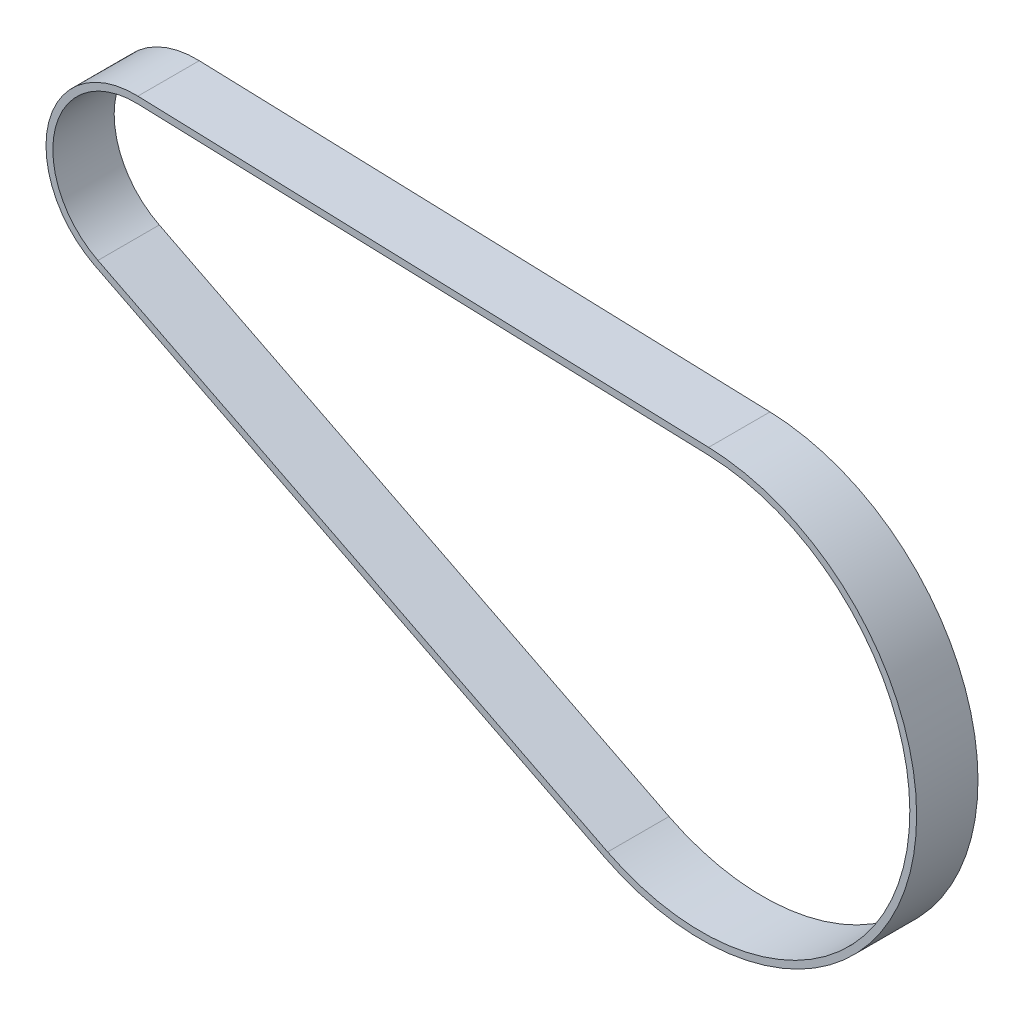
ISO-10303-21;
HEADER;
FILE_DESCRIPTION(('STEP AP214'),'2;1');
FILE_NAME('part.step','',(''),(''),'','','');
FILE_SCHEMA(('AUTOMOTIVE_DESIGN { 1 0 10303 214 1 1 1 1 }'));
ENDSEC;
DATA;
#1=APPLICATION_CONTEXT('core data for automotive mechanical design processes');
#2=APPLICATION_PROTOCOL_DEFINITION('international standard','automotive_design',2000,#1);
#3=PRODUCT_CONTEXT('',#1,'mechanical');
#4=PRODUCT('Part','Part','',(#3));
#5=PRODUCT_RELATED_PRODUCT_CATEGORY('part','',(#4));
#6=PRODUCT_DEFINITION_FORMATION('','',#4);
#7=PRODUCT_DEFINITION_CONTEXT('part definition',#1,'design');
#8=PRODUCT_DEFINITION('design','',#6,#7);
#9=PRODUCT_DEFINITION_SHAPE('','',#8);
#10=(LENGTH_UNIT() NAMED_UNIT(*) SI_UNIT(.MILLI.,.METRE.));
#11=(NAMED_UNIT(*) PLANE_ANGLE_UNIT() SI_UNIT($,.RADIAN.));
#12=(NAMED_UNIT(*) SI_UNIT($,.STERADIAN.) SOLID_ANGLE_UNIT());
#13=UNCERTAINTY_MEASURE_WITH_UNIT(LENGTH_MEASURE(1.E-05),#10,'distance_accuracy_value','');
#14=(GEOMETRIC_REPRESENTATION_CONTEXT(3) GLOBAL_UNCERTAINTY_ASSIGNED_CONTEXT((#13)) GLOBAL_UNIT_ASSIGNED_CONTEXT((#10,
#11,#12)) REPRESENTATION_CONTEXT('',''));
#15=CARTESIAN_POINT('',(0.,0.,0.));
#16=DIRECTION('',(0.,0.,1.));
#17=DIRECTION('',(1.,0.,0.));
#18=AXIS2_PLACEMENT_3D('',#15,#16,#17);
#19=CARTESIAN_POINT('',(0.,0.,-4.5));
#20=DIRECTION('',(0.,0.,1.));
#21=DIRECTION('',(1.,0.,0.));
#22=AXIS2_PLACEMENT_3D('',#19,#20,#21);
#23=CYLINDRICAL_SURFACE('',#22,31.55);
#24=DIRECTION('',(0.,0.,1.));
#25=VECTOR('',#24,1.);
#26=CARTESIAN_POINT('',(1.03885080868558,31.5328921762229,-4.5));
#27=LINE('',#26,#25);
#28=CARTESIAN_POINT('',(1.03885080868558,31.5328921762229,-4.5));
#29=VERTEX_POINT('',#28);
#30=CARTESIAN_POINT('',(1.03885080868558,31.5328921762229,4.5));
#31=VERTEX_POINT('',#30);
#32=EDGE_CURVE('E88',#29,#31,#27,.T.);
#33=ORIENTED_EDGE('',*,*,#32,.T.);
#34=CARTESIAN_POINT('',(0.,0.,4.5));
#35=DIRECTION('',(0.,0.,-1.));
#36=DIRECTION('',(-1.,0.,0.));
#37=AXIS2_PLACEMENT_3D('',#34,#35,#36);
#38=CIRCLE('',#37,31.55);
#39=CARTESIAN_POINT('',(-14.2241870774265,-28.1615873484854,4.5));
#40=VERTEX_POINT('',#39);
#41=EDGE_CURVE('E180',#40,#31,#38,.F.);
#42=ORIENTED_EDGE('',*,*,#41,.F.);
#43=DIRECTION('',(0.,0.,1.));
#44=VECTOR('',#43,1.);
#45=CARTESIAN_POINT('',(-14.2241870774265,-28.1615873484854,-4.5));
#46=LINE('',#45,#44);
#47=CARTESIAN_POINT('',(-14.2241870774265,-28.1615873484854,-4.5));
#48=VERTEX_POINT('',#47);
#49=EDGE_CURVE('E12',#48,#40,#46,.T.);
#50=ORIENTED_EDGE('',*,*,#49,.F.);
#51=CARTESIAN_POINT('',(0.,0.,-4.5));
#52=DIRECTION('',(0.,0.,-1.));
#53=DIRECTION('',(-1.,0.,0.));
#54=AXIS2_PLACEMENT_3D('',#51,#52,#53);
#55=CIRCLE('',#54,31.55);
#56=EDGE_CURVE('E199',#48,#29,#55,.F.);
#57=ORIENTED_EDGE('',*,*,#56,.T.);
#58=EDGE_LOOP('',(#33,#42,#50,#57));
#59=FACE_BOUND('',#58,.T.);
#60=ADVANCED_FACE('F85',(#59),#23,.T.);
#61=CARTESIAN_POINT('',(-14.2241870774265,-28.1615873484854,-4.5));
#62=DIRECTION('',(-0.450845866162487,-0.892601817701598,0.));
#63=DIRECTION('',(0.892601817701598,-0.450845866162487,0.));
#64=AXIS2_PLACEMENT_3D('',#61,#62,#63);
#65=PLANE('',#64);
#66=ORIENTED_EDGE('',*,*,#49,.T.);
#67=DIRECTION('',(0.892601817701598,-0.450845866162487,0.));
#68=VECTOR('',#67,1.);
#69=CARTESIAN_POINT('',(-14.2241870774265,-28.1615873484854,4.5));
#70=LINE('',#69,#68);
#71=CARTESIAN_POINT('',(-88.9847314521121,9.5993511965133,4.5));
#72=VERTEX_POINT('',#71);
#73=EDGE_CURVE('E189',#72,#40,#70,.T.);
#74=ORIENTED_EDGE('',*,*,#73,.F.);
#75=DIRECTION('',(0.,0.,1.));
#76=VECTOR('',#75,1.);
#77=CARTESIAN_POINT('',(-88.9847314521121,9.5993511965133,-4.5));
#78=LINE('',#77,#76);
#79=CARTESIAN_POINT('',(-88.9847314521121,9.5993511965133,-4.5));
#80=VERTEX_POINT('',#79);
#81=EDGE_CURVE('E93',#80,#72,#78,.T.);
#82=ORIENTED_EDGE('',*,*,#81,.F.);
#83=DIRECTION('',(0.892601817701598,-0.450845866162487,0.));
#84=VECTOR('',#83,1.);
#85=CARTESIAN_POINT('',(-14.2241870774265,-28.1615873484854,-4.5));
#86=LINE('',#85,#84);
#87=EDGE_CURVE('E210',#80,#48,#86,.T.);
#88=ORIENTED_EDGE('',*,*,#87,.T.);
#89=EDGE_LOOP('',(#66,#74,#82,#88));
#90=FACE_BOUND('',#89,.T.);
#91=ADVANCED_FACE('F222',(#90),#65,.T.);
#92=CARTESIAN_POINT('',(-83.1011928986916,21.2478049175192,-4.5));
#93=DIRECTION('',(0.,0.,1.));
#94=DIRECTION('',(1.,0.,0.));
#95=AXIS2_PLACEMENT_3D('',#92,#93,#94);
#96=CYLINDRICAL_SURFACE('',#95,13.05);
#97=ORIENTED_EDGE('',*,*,#81,.T.);
#98=CARTESIAN_POINT('',(-83.1011928986916,21.2478049175192,4.5));
#99=DIRECTION('',(0.,0.,-1.));
#100=DIRECTION('',(-1.,0.,0.));
#101=AXIS2_PLACEMENT_3D('',#98,#99,#100);
#102=CIRCLE('',#101,13.05);
#103=CARTESIAN_POINT('',(-82.6714939112638,34.2907286227397,4.5));
#104=VERTEX_POINT('',#103);
#105=EDGE_CURVE('E186',#104,#72,#102,.F.);
#106=ORIENTED_EDGE('',*,*,#105,.F.);
#107=DIRECTION('',(0.,0.,1.));
#108=VECTOR('',#107,1.);
#109=CARTESIAN_POINT('',(-82.6714939112638,34.2907286227397,-4.5));
#110=LINE('',#109,#108);
#111=CARTESIAN_POINT('',(-82.6714939112638,34.2907286227397,-4.5));
#112=VERTEX_POINT('',#111);
#113=EDGE_CURVE('E213',#112,#104,#110,.T.);
#114=ORIENTED_EDGE('',*,*,#113,.F.);
#115=CARTESIAN_POINT('',(-83.1011928986916,21.2478049175192,-4.5));
#116=DIRECTION('',(0.,0.,-1.));
#117=DIRECTION('',(-1.,0.,0.));
#118=AXIS2_PLACEMENT_3D('',#115,#116,#117);
#119=CIRCLE('',#118,13.05);
#120=EDGE_CURVE('E207',#112,#80,#119,.F.);
#121=ORIENTED_EDGE('',*,*,#120,.T.);
#122=EDGE_LOOP('',(#97,#106,#114,#121));
#123=FACE_BOUND('',#122,.T.);
#124=ADVANCED_FACE('F228',(#123),#96,.T.);
#125=CARTESIAN_POINT('',(1.03885080868557,31.5328921762229,-4.5));
#126=DIRECTION('',(0.0329271254733955,0.999457755189312,0.));
#127=DIRECTION('',(-0.999457755189312,0.0329271254733956,0.));
#128=AXIS2_PLACEMENT_3D('',#125,#126,#127);
#129=PLANE('',#128);
#130=ORIENTED_EDGE('',*,*,#113,.T.);
#131=DIRECTION('',(-0.999457755189312,0.0329271254733955,0.));
#132=VECTOR('',#131,1.);
#133=CARTESIAN_POINT('',(1.03885080868557,31.5328921762229,4.5));
#134=LINE('',#133,#132);
#135=EDGE_CURVE('E183',#31,#104,#134,.T.);
#136=ORIENTED_EDGE('',*,*,#135,.F.);
#137=ORIENTED_EDGE('',*,*,#32,.F.);
#138=DIRECTION('',(-0.999457755189312,0.0329271254733955,0.));
#139=VECTOR('',#138,1.);
#140=CARTESIAN_POINT('',(1.03885080868557,31.5328921762229,-4.5));
#141=LINE('',#140,#139);
#142=EDGE_CURVE('E204',#29,#112,#141,.T.);
#143=ORIENTED_EDGE('',*,*,#142,.T.);
#144=EDGE_LOOP('',(#130,#136,#137,#143));
#145=FACE_BOUND('',#144,.T.);
#146=ADVANCED_FACE('F217',(#145),#129,.T.);
#147=CARTESIAN_POINT('',(0.,0.,-4.5));
#148=DIRECTION('',(0.,0.,-1.));
#149=DIRECTION('',(-1.,0.,0.));
#150=AXIS2_PLACEMENT_3D('',#147,#148,#149);
#151=PLANE('',#150);
#152=CARTESIAN_POINT('',(0.,0.,-4.5));
#153=DIRECTION('',(0.,0.,1.));
#154=DIRECTION('',(-1.,0.,0.));
#155=AXIS2_PLACEMENT_3D('',#152,#153,#154);
#156=CIRCLE('',#155,30.55);
#157=CARTESIAN_POINT('',(-13.773341211264,-27.2689855307838,-4.5));
#158=VERTEX_POINT('',#157);
#159=CARTESIAN_POINT('',(1.00592368321218,30.5334344210335,-4.5));
#160=VERTEX_POINT('',#159);
#161=EDGE_CURVE('E192',#158,#160,#156,.T.);
#162=ORIENTED_EDGE('',*,*,#161,.T.);
#163=DIRECTION('',(-0.999457755189312,0.0329271254733955,0.));
#164=VECTOR('',#163,1.);
#165=CARTESIAN_POINT('',(-82.7044210367372,33.2912708675504,-4.5));
#166=LINE('',#165,#164);
#167=CARTESIAN_POINT('',(-82.7044210367372,33.2912708675504,-4.5));
#168=VERTEX_POINT('',#167);
#169=EDGE_CURVE('E157',#160,#168,#166,.T.);
#170=ORIENTED_EDGE('',*,*,#169,.T.);
#171=CARTESIAN_POINT('',(-83.1011928986916,21.2478049175192,-4.5));
#172=DIRECTION('',(0.,0.,1.));
#173=DIRECTION('',(-1.,0.,0.));
#174=AXIS2_PLACEMENT_3D('',#171,#172,#173);
#175=CIRCLE('',#174,12.05);
#176=CARTESIAN_POINT('',(-88.5338855859496,10.4919530142149,-4.5));
#177=VERTEX_POINT('',#176);
#178=EDGE_CURVE('E101',#168,#177,#175,.T.);
#179=ORIENTED_EDGE('',*,*,#178,.T.);
#180=DIRECTION('',(0.892601817701598,-0.450845866162487,0.));
#181=VECTOR('',#180,1.);
#182=CARTESIAN_POINT('',(-13.773341211264,-27.2689855307838,-4.5));
#183=LINE('',#182,#181);
#184=EDGE_CURVE('E162',#177,#158,#183,.T.);
#185=ORIENTED_EDGE('',*,*,#184,.T.);
#186=EDGE_LOOP('',(#162,#170,#179,#185));
#187=FACE_BOUND('',#186,.T.);
#188=ORIENTED_EDGE('',*,*,#56,.F.);
#189=ORIENTED_EDGE('',*,*,#87,.F.);
#190=ORIENTED_EDGE('',*,*,#120,.F.);
#191=ORIENTED_EDGE('',*,*,#142,.F.);
#192=EDGE_LOOP('',(#188,#189,#190,#191));
#193=FACE_BOUND('',#192,.T.);
#194=ADVANCED_FACE('F226',(#187,#193),#151,.T.);
#195=CARTESIAN_POINT('',(0.,0.,-4.5));
#196=DIRECTION('',(0.,0.,1.));
#197=DIRECTION('',(1.,0.,0.));
#198=AXIS2_PLACEMENT_3D('',#195,#196,#197);
#199=CYLINDRICAL_SURFACE('',#198,30.55);
#200=DIRECTION('',(0.,0.,1.));
#201=VECTOR('',#200,1.);
#202=CARTESIAN_POINT('',(-13.773341211264,-27.2689855307838,-4.5));
#203=LINE('',#202,#201);
#204=CARTESIAN_POINT('',(-13.773341211264,-27.2689855307838,4.5));
#205=VERTEX_POINT('',#204);
#206=EDGE_CURVE('E167',#158,#205,#203,.T.);
#207=ORIENTED_EDGE('',*,*,#206,.T.);
#208=CARTESIAN_POINT('',(0.,0.,4.5));
#209=DIRECTION('',(0.,0.,1.));
#210=DIRECTION('',(-1.,0.,0.));
#211=AXIS2_PLACEMENT_3D('',#208,#209,#210);
#212=CIRCLE('',#211,30.55);
#213=CARTESIAN_POINT('',(1.00592368321218,30.5334344210335,4.5));
#214=VERTEX_POINT('',#213);
#215=EDGE_CURVE('E165',#205,#214,#212,.T.);
#216=ORIENTED_EDGE('',*,*,#215,.T.);
#217=DIRECTION('',(0.,0.,1.));
#218=VECTOR('',#217,1.);
#219=CARTESIAN_POINT('',(1.00592368321218,30.5334344210335,-4.5));
#220=LINE('',#219,#218);
#221=EDGE_CURVE('E150',#160,#214,#220,.T.);
#222=ORIENTED_EDGE('',*,*,#221,.F.);
#223=ORIENTED_EDGE('',*,*,#161,.F.);
#224=EDGE_LOOP('',(#207,#216,#222,#223));
#225=FACE_BOUND('',#224,.T.);
#226=ADVANCED_FACE('F166',(#225),#199,.F.);
#227=CARTESIAN_POINT('',(-13.773341211264,-27.2689855307838,-4.5));
#228=DIRECTION('',(-0.450845866162487,-0.892601817701598,0.));
#229=DIRECTION('',(0.892601817701598,-0.450845866162487,0.));
#230=AXIS2_PLACEMENT_3D('',#227,#228,#229);
#231=PLANE('',#230);
#232=DIRECTION('',(0.,0.,1.));
#233=VECTOR('',#232,1.);
#234=CARTESIAN_POINT('',(-88.5338855859496,10.4919530142149,-4.5));
#235=LINE('',#234,#233);
#236=CARTESIAN_POINT('',(-88.5338855859496,10.4919530142149,4.5));
#237=VERTEX_POINT('',#236);
#238=EDGE_CURVE('E200',#177,#237,#235,.T.);
#239=ORIENTED_EDGE('',*,*,#238,.T.);
#240=DIRECTION('',(0.892601817701598,-0.450845866162487,0.));
#241=VECTOR('',#240,1.);
#242=CARTESIAN_POINT('',(-13.773341211264,-27.2689855307838,4.5));
#243=LINE('',#242,#241);
#244=EDGE_CURVE('E176',#237,#205,#243,.T.);
#245=ORIENTED_EDGE('',*,*,#244,.T.);
#246=ORIENTED_EDGE('',*,*,#206,.F.);
#247=ORIENTED_EDGE('',*,*,#184,.F.);
#248=EDGE_LOOP('',(#239,#245,#246,#247));
#249=FACE_BOUND('',#248,.T.);
#250=ADVANCED_FACE('F271',(#249),#231,.F.);
#251=CARTESIAN_POINT('',(-83.1011928986916,21.2478049175192,-4.5));
#252=DIRECTION('',(0.,0.,1.));
#253=DIRECTION('',(1.,0.,0.));
#254=AXIS2_PLACEMENT_3D('',#251,#252,#253);
#255=CYLINDRICAL_SURFACE('',#254,12.05);
#256=DIRECTION('',(0.,0.,1.));
#257=VECTOR('',#256,1.);
#258=CARTESIAN_POINT('',(-82.7044210367372,33.2912708675504,-4.5));
#259=LINE('',#258,#257);
#260=CARTESIAN_POINT('',(-82.7044210367372,33.2912708675504,4.5));
#261=VERTEX_POINT('',#260);
#262=EDGE_CURVE('E161',#168,#261,#259,.T.);
#263=ORIENTED_EDGE('',*,*,#262,.T.);
#264=CARTESIAN_POINT('',(-83.1011928986916,21.2478049175192,4.5));
#265=DIRECTION('',(0.,0.,1.));
#266=DIRECTION('',(-1.,0.,0.));
#267=AXIS2_PLACEMENT_3D('',#264,#265,#266);
#268=CIRCLE('',#267,12.05);
#269=EDGE_CURVE('E174',#261,#237,#268,.T.);
#270=ORIENTED_EDGE('',*,*,#269,.T.);
#271=ORIENTED_EDGE('',*,*,#238,.F.);
#272=ORIENTED_EDGE('',*,*,#178,.F.);
#273=EDGE_LOOP('',(#263,#270,#271,#272));
#274=FACE_BOUND('',#273,.T.);
#275=ADVANCED_FACE('F280',(#274),#255,.F.);
#276=CARTESIAN_POINT('',(-82.7044210367372,33.2912708675504,-4.5));
#277=DIRECTION('',(0.0329271254733955,0.999457755189312,0.));
#278=DIRECTION('',(-0.999457755189312,0.0329271254733955,0.));
#279=AXIS2_PLACEMENT_3D('',#276,#277,#278);
#280=PLANE('',#279);
#281=ORIENTED_EDGE('',*,*,#221,.T.);
#282=DIRECTION('',(-0.999457755189312,0.0329271254733955,0.));
#283=VECTOR('',#282,1.);
#284=CARTESIAN_POINT('',(-82.7044210367372,33.2912708675504,4.5));
#285=LINE('',#284,#283);
#286=EDGE_CURVE('E154',#214,#261,#285,.T.);
#287=ORIENTED_EDGE('',*,*,#286,.T.);
#288=ORIENTED_EDGE('',*,*,#262,.F.);
#289=ORIENTED_EDGE('',*,*,#169,.F.);
#290=EDGE_LOOP('',(#281,#287,#288,#289));
#291=FACE_BOUND('',#290,.T.);
#292=ADVANCED_FACE('F152',(#291),#280,.F.);
#293=CARTESIAN_POINT('',(0.,0.,4.5));
#294=DIRECTION('',(0.,0.,-1.));
#295=DIRECTION('',(-1.,0.,0.));
#296=AXIS2_PLACEMENT_3D('',#293,#294,#295);
#297=PLANE('',#296);
#298=ORIENTED_EDGE('',*,*,#41,.T.);
#299=ORIENTED_EDGE('',*,*,#135,.T.);
#300=ORIENTED_EDGE('',*,*,#105,.T.);
#301=ORIENTED_EDGE('',*,*,#73,.T.);
#302=EDGE_LOOP('',(#298,#299,#300,#301));
#303=FACE_BOUND('',#302,.T.);
#304=ORIENTED_EDGE('',*,*,#215,.F.);
#305=ORIENTED_EDGE('',*,*,#244,.F.);
#306=ORIENTED_EDGE('',*,*,#269,.F.);
#307=ORIENTED_EDGE('',*,*,#286,.F.);
#308=EDGE_LOOP('',(#304,#305,#306,#307));
#309=FACE_BOUND('',#308,.T.);
#310=ADVANCED_FACE('F172',(#303,#309),#297,.F.);
#311=CLOSED_SHELL('',(#60,#91,#124,#146,#194,#226,#250,#275,#292,#310));
#312=MANIFOLD_SOLID_BREP('B2',#311);
#313=ADVANCED_BREP_SHAPE_REPRESENTATION('',(#18,#312),#14);
#314=SHAPE_DEFINITION_REPRESENTATION(#9,#313);
ENDSEC;
END-ISO-10303-21;
